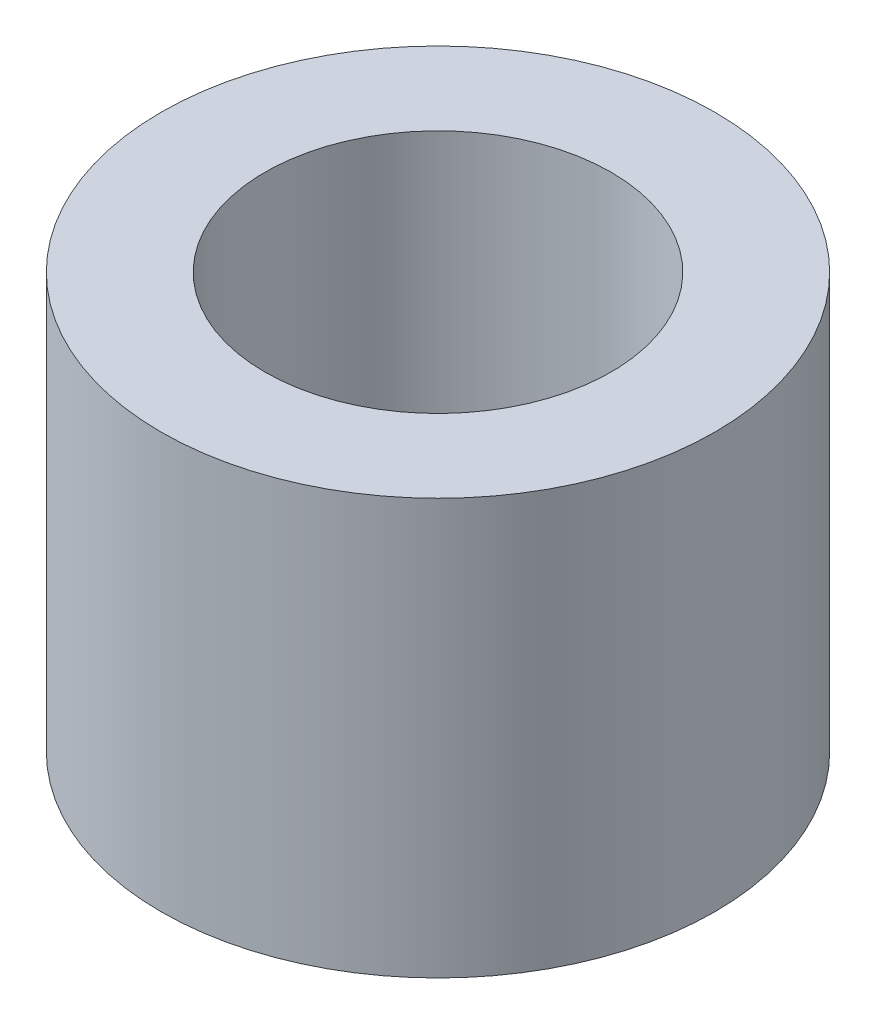
ISO-10303-21;
HEADER;
FILE_DESCRIPTION(('STEP AP214'),'2;1');
FILE_NAME('part.step','',(''),(''),'','','');
FILE_SCHEMA(('AUTOMOTIVE_DESIGN { 1 0 10303 214 1 1 1 1 }'));
ENDSEC;
DATA;
#1=APPLICATION_CONTEXT('core data for automotive mechanical design processes');
#2=APPLICATION_PROTOCOL_DEFINITION('international standard','automotive_design',2000,#1);
#3=PRODUCT_CONTEXT('',#1,'mechanical');
#4=PRODUCT('Part','Part','',(#3));
#5=PRODUCT_RELATED_PRODUCT_CATEGORY('part','',(#4));
#6=PRODUCT_DEFINITION_FORMATION('','',#4);
#7=PRODUCT_DEFINITION_CONTEXT('part definition',#1,'design');
#8=PRODUCT_DEFINITION('design','',#6,#7);
#9=PRODUCT_DEFINITION_SHAPE('','',#8);
#10=(LENGTH_UNIT() NAMED_UNIT(*) SI_UNIT(.MILLI.,.METRE.));
#11=(NAMED_UNIT(*) PLANE_ANGLE_UNIT() SI_UNIT($,.RADIAN.));
#12=(NAMED_UNIT(*) SI_UNIT($,.STERADIAN.) SOLID_ANGLE_UNIT());
#13=UNCERTAINTY_MEASURE_WITH_UNIT(LENGTH_MEASURE(1.E-05),#10,'distance_accuracy_value','');
#14=(GEOMETRIC_REPRESENTATION_CONTEXT(3) GLOBAL_UNCERTAINTY_ASSIGNED_CONTEXT((#13)) GLOBAL_UNIT_ASSIGNED_CONTEXT((#10,
#11,#12)) REPRESENTATION_CONTEXT('',''));
#15=CARTESIAN_POINT('',(0.,0.,0.));
#16=DIRECTION('',(0.,0.,1.));
#17=DIRECTION('',(1.,0.,0.));
#18=AXIS2_PLACEMENT_3D('',#15,#16,#17);
#19=CARTESIAN_POINT('',(-5.,7.16190476190476,0.));
#20=DIRECTION('',(0.,1.,0.));
#21=DIRECTION('',(0.,0.,1.));
#22=AXIS2_PLACEMENT_3D('',#19,#20,#21);
#23=PLANE('',#22);
#24=CARTESIAN_POINT('',(0.,7.16190476190476,0.));
#25=DIRECTION('',(0.,1.,0.));
#26=DIRECTION('',(0.,0.,1.));
#27=AXIS2_PLACEMENT_3D('',#24,#25,#26);
#28=CIRCLE('',#27,8.);
#29=CARTESIAN_POINT('',(0.,7.16190476190476,8.));
#30=VERTEX_POINT('',#29);
#31=EDGE_CURVE('E10',#30,#30,#28,.T.);
#32=ORIENTED_EDGE('',*,*,#31,.T.);
#33=EDGE_LOOP('',(#32));
#34=FACE_BOUND('',#33,.T.);
#35=CARTESIAN_POINT('',(0.,7.16190476190476,0.));
#36=DIRECTION('',(0.,1.,0.));
#37=DIRECTION('',(0.,0.,1.));
#38=AXIS2_PLACEMENT_3D('',#35,#36,#37);
#39=CIRCLE('',#38,5.);
#40=CARTESIAN_POINT('',(0.,7.16190476190476,5.));
#41=VERTEX_POINT('',#40);
#42=EDGE_CURVE('E45',#41,#41,#39,.T.);
#43=ORIENTED_EDGE('',*,*,#42,.F.);
#44=EDGE_LOOP('',(#43));
#45=FACE_BOUND('',#44,.T.);
#46=ADVANCED_FACE('F31',(#34,#45),#23,.T.);
#47=CARTESIAN_POINT('',(0.,10.4761904761905,0.));
#48=DIRECTION('',(0.,1.,0.));
#49=DIRECTION('',(0.,0.,1.));
#50=AXIS2_PLACEMENT_3D('',#47,#48,#49);
#51=CYLINDRICAL_SURFACE('',#50,8.);
#52=CARTESIAN_POINT('',(0.,-4.83809523809524,0.));
#53=DIRECTION('',(0.,1.,0.));
#54=DIRECTION('',(0.,0.,1.));
#55=AXIS2_PLACEMENT_3D('',#52,#53,#54);
#56=CIRCLE('',#55,8.);
#57=CARTESIAN_POINT('',(0.,-4.83809523809524,8.));
#58=VERTEX_POINT('',#57);
#59=EDGE_CURVE('E37',#58,#58,#56,.T.);
#60=ORIENTED_EDGE('',*,*,#59,.T.);
#61=EDGE_LOOP('',(#60));
#62=FACE_BOUND('',#61,.T.);
#63=ORIENTED_EDGE('',*,*,#31,.F.);
#64=EDGE_LOOP('',(#63));
#65=FACE_BOUND('',#64,.T.);
#66=ADVANCED_FACE('F55',(#62,#65),#51,.T.);
#67=CARTESIAN_POINT('',(-8.,-4.83809523809524,0.));
#68=DIRECTION('',(0.,-1.,0.));
#69=DIRECTION('',(0.,0.,-1.));
#70=AXIS2_PLACEMENT_3D('',#67,#68,#69);
#71=PLANE('',#70);
#72=CARTESIAN_POINT('',(0.,-4.83809523809524,0.));
#73=DIRECTION('',(0.,1.,0.));
#74=DIRECTION('',(0.,0.,1.));
#75=AXIS2_PLACEMENT_3D('',#72,#73,#74);
#76=CIRCLE('',#75,5.);
#77=CARTESIAN_POINT('',(0.,-4.83809523809524,5.));
#78=VERTEX_POINT('',#77);
#79=EDGE_CURVE('E41',#78,#78,#76,.T.);
#80=ORIENTED_EDGE('',*,*,#79,.T.);
#81=EDGE_LOOP('',(#80));
#82=FACE_BOUND('',#81,.T.);
#83=ORIENTED_EDGE('',*,*,#59,.F.);
#84=EDGE_LOOP('',(#83));
#85=FACE_BOUND('',#84,.T.);
#86=ADVANCED_FACE('F59',(#82,#85),#71,.T.);
#87=CARTESIAN_POINT('',(0.,10.4761904761905,0.));
#88=DIRECTION('',(0.,1.,0.));
#89=DIRECTION('',(0.,0.,1.));
#90=AXIS2_PLACEMENT_3D('',#87,#88,#89);
#91=CYLINDRICAL_SURFACE('',#90,5.);
#92=ORIENTED_EDGE('',*,*,#42,.T.);
#93=EDGE_LOOP('',(#92));
#94=FACE_BOUND('',#93,.T.);
#95=ORIENTED_EDGE('',*,*,#79,.F.);
#96=EDGE_LOOP('',(#95));
#97=FACE_BOUND('',#96,.T.);
#98=ADVANCED_FACE('F51',(#94,#97),#91,.F.);
#99=CLOSED_SHELL('',(#46,#66,#86,#98));
#100=MANIFOLD_SOLID_BREP('B2',#99);
#101=ADVANCED_BREP_SHAPE_REPRESENTATION('',(#18,#100),#14);
#102=SHAPE_DEFINITION_REPRESENTATION(#9,#101);
ENDSEC;
END-ISO-10303-21;
